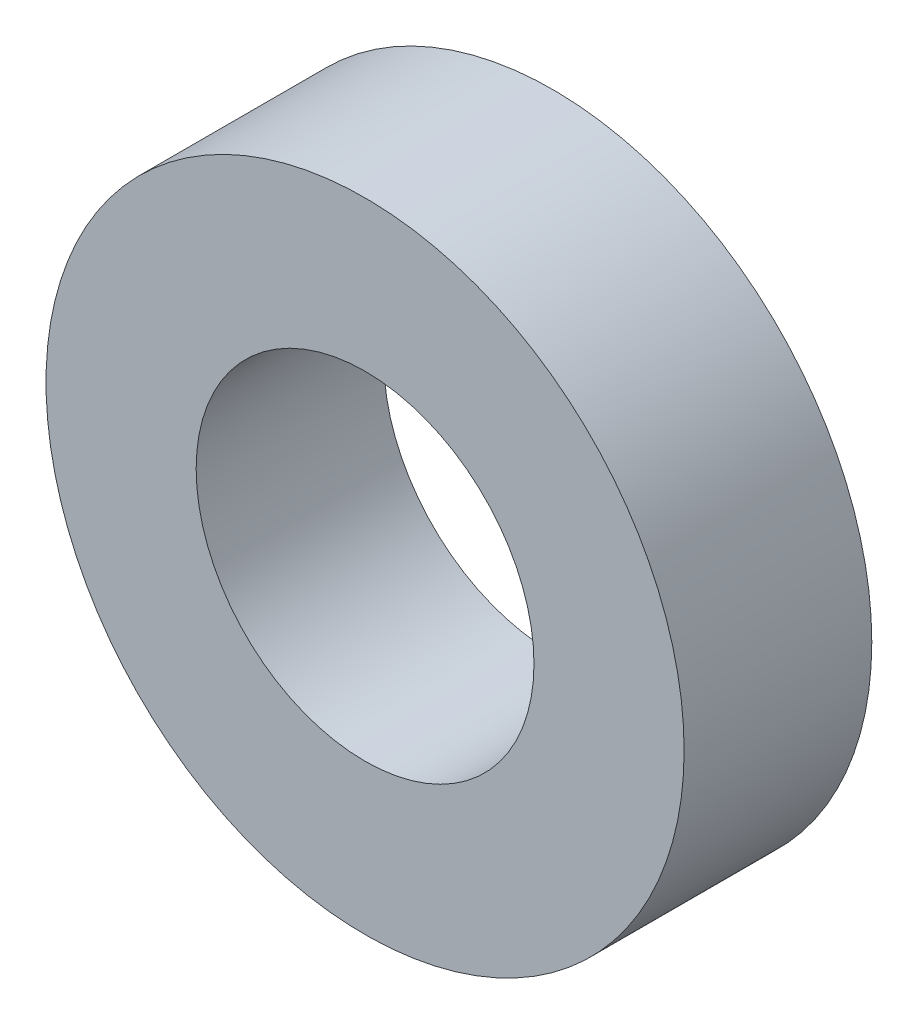
ISO-10303-21;
HEADER;
FILE_DESCRIPTION(('STEP AP214'),'2;1');
FILE_NAME('part.step','',(''),(''),'','','');
FILE_SCHEMA(('AUTOMOTIVE_DESIGN { 1 0 10303 214 1 1 1 1 }'));
ENDSEC;
DATA;
#1=APPLICATION_CONTEXT('core data for automotive mechanical design processes');
#2=APPLICATION_PROTOCOL_DEFINITION('international standard','automotive_design',2000,#1);
#3=PRODUCT_CONTEXT('',#1,'mechanical');
#4=PRODUCT('Part','Part','',(#3));
#5=PRODUCT_RELATED_PRODUCT_CATEGORY('part','',(#4));
#6=PRODUCT_DEFINITION_FORMATION('','',#4);
#7=PRODUCT_DEFINITION_CONTEXT('part definition',#1,'design');
#8=PRODUCT_DEFINITION('design','',#6,#7);
#9=PRODUCT_DEFINITION_SHAPE('','',#8);
#10=(LENGTH_UNIT() NAMED_UNIT(*) SI_UNIT(.MILLI.,.METRE.));
#11=(NAMED_UNIT(*) PLANE_ANGLE_UNIT() SI_UNIT($,.RADIAN.));
#12=(NAMED_UNIT(*) SI_UNIT($,.STERADIAN.) SOLID_ANGLE_UNIT());
#13=UNCERTAINTY_MEASURE_WITH_UNIT(LENGTH_MEASURE(1.E-05),#10,'distance_accuracy_value','');
#14=(GEOMETRIC_REPRESENTATION_CONTEXT(3) GLOBAL_UNCERTAINTY_ASSIGNED_CONTEXT((#13)) GLOBAL_UNIT_ASSIGNED_CONTEXT((#10,
#11,#12)) REPRESENTATION_CONTEXT('',''));
#15=CARTESIAN_POINT('',(0.,0.,0.));
#16=DIRECTION('',(0.,0.,1.));
#17=DIRECTION('',(1.,0.,0.));
#18=AXIS2_PLACEMENT_3D('',#15,#16,#17);
#19=CARTESIAN_POINT('',(0.,0.,5.));
#20=DIRECTION('',(0.,0.,1.));
#21=DIRECTION('',(1.,0.,0.));
#22=AXIS2_PLACEMENT_3D('',#19,#20,#21);
#23=PLANE('',#22);
#24=CARTESIAN_POINT('',(0.,0.,5.));
#25=DIRECTION('',(0.,0.,1.));
#26=DIRECTION('',(1.,0.,0.));
#27=AXIS2_PLACEMENT_3D('',#24,#25,#26);
#28=CIRCLE('',#27,8.5);
#29=CARTESIAN_POINT('',(8.5,0.,5.));
#30=VERTEX_POINT('',#29);
#31=EDGE_CURVE('E10',#30,#30,#28,.T.);
#32=ORIENTED_EDGE('',*,*,#31,.T.);
#33=EDGE_LOOP('',(#32));
#34=FACE_BOUND('',#33,.T.);
#35=CARTESIAN_POINT('',(0.,0.,5.));
#36=DIRECTION('',(0.,0.,1.));
#37=DIRECTION('',(1.,0.,0.));
#38=AXIS2_PLACEMENT_3D('',#35,#36,#37);
#39=CIRCLE('',#38,4.5);
#40=CARTESIAN_POINT('',(4.5,0.,5.));
#41=VERTEX_POINT('',#40);
#42=EDGE_CURVE('E50',#41,#41,#39,.T.);
#43=ORIENTED_EDGE('',*,*,#42,.F.);
#44=EDGE_LOOP('',(#43));
#45=FACE_BOUND('',#44,.T.);
#46=ADVANCED_FACE('F39',(#34,#45),#23,.T.);
#47=CARTESIAN_POINT('',(0.,0.,0.));
#48=DIRECTION('',(0.,0.,1.));
#49=DIRECTION('',(1.,0.,0.));
#50=AXIS2_PLACEMENT_3D('',#47,#48,#49);
#51=PLANE('',#50);
#52=CARTESIAN_POINT('',(0.,0.,0.));
#53=DIRECTION('',(0.,0.,1.));
#54=DIRECTION('',(1.,0.,0.));
#55=AXIS2_PLACEMENT_3D('',#52,#53,#54);
#56=CIRCLE('',#55,8.5);
#57=CARTESIAN_POINT('',(8.5,0.,0.));
#58=VERTEX_POINT('',#57);
#59=EDGE_CURVE('E43',#58,#58,#56,.T.);
#60=ORIENTED_EDGE('',*,*,#59,.F.);
#61=EDGE_LOOP('',(#60));
#62=FACE_BOUND('',#61,.T.);
#63=CARTESIAN_POINT('',(0.,0.,0.));
#64=DIRECTION('',(0.,0.,1.));
#65=DIRECTION('',(1.,0.,0.));
#66=AXIS2_PLACEMENT_3D('',#63,#64,#65);
#67=CIRCLE('',#66,4.5);
#68=CARTESIAN_POINT('',(4.5,0.,0.));
#69=VERTEX_POINT('',#68);
#70=EDGE_CURVE('E52',#69,#69,#67,.T.);
#71=ORIENTED_EDGE('',*,*,#70,.T.);
#72=EDGE_LOOP('',(#71));
#73=FACE_BOUND('',#72,.T.);
#74=ADVANCED_FACE('F62',(#62,#73),#51,.F.);
#75=CARTESIAN_POINT('',(0.,0.,5.));
#76=DIRECTION('',(0.,0.,-1.));
#77=DIRECTION('',(-1.,0.,0.));
#78=AXIS2_PLACEMENT_3D('',#75,#76,#77);
#79=CYLINDRICAL_SURFACE('',#78,8.5);
#80=ORIENTED_EDGE('',*,*,#31,.F.);
#81=EDGE_LOOP('',(#80));
#82=FACE_BOUND('',#81,.T.);
#83=ORIENTED_EDGE('',*,*,#59,.T.);
#84=EDGE_LOOP('',(#83));
#85=FACE_BOUND('',#84,.T.);
#86=ADVANCED_FACE('F41',(#82,#85),#79,.T.);
#87=CARTESIAN_POINT('',(0.,0.,5.));
#88=DIRECTION('',(0.,0.,-1.));
#89=DIRECTION('',(-1.,0.,0.));
#90=AXIS2_PLACEMENT_3D('',#87,#88,#89);
#91=CYLINDRICAL_SURFACE('',#90,4.5);
#92=ORIENTED_EDGE('',*,*,#42,.T.);
#93=EDGE_LOOP('',(#92));
#94=FACE_BOUND('',#93,.T.);
#95=ORIENTED_EDGE('',*,*,#70,.F.);
#96=EDGE_LOOP('',(#95));
#97=FACE_BOUND('',#96,.T.);
#98=ADVANCED_FACE('F58',(#94,#97),#91,.F.);
#99=CLOSED_SHELL('',(#46,#74,#86,#98));
#100=MANIFOLD_SOLID_BREP('B2',#99);
#101=ADVANCED_BREP_SHAPE_REPRESENTATION('',(#18,#100),#14);
#102=SHAPE_DEFINITION_REPRESENTATION(#9,#101);
ENDSEC;
END-ISO-10303-21;
